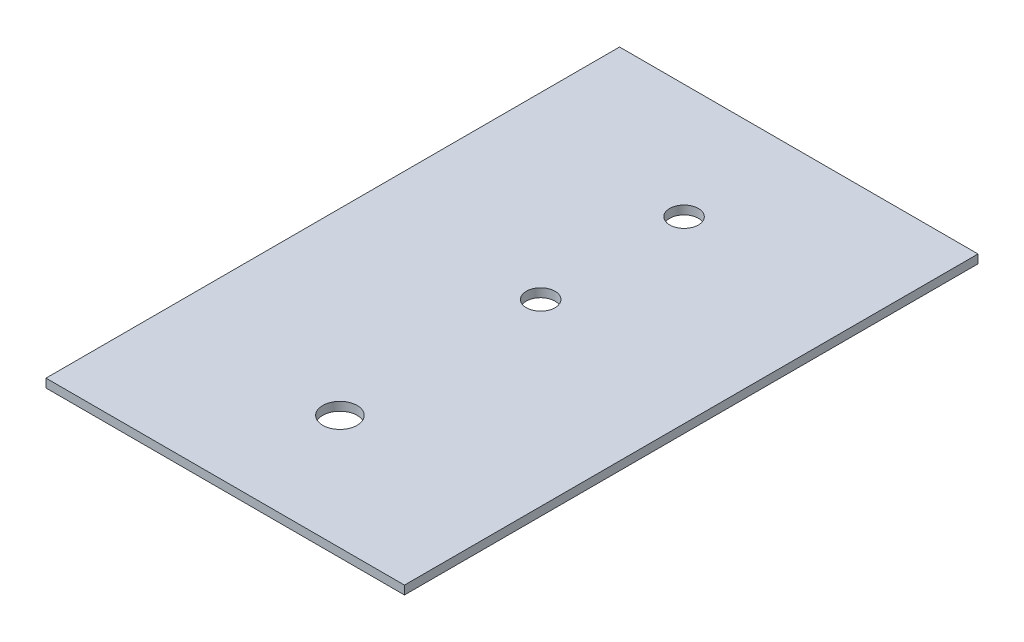
ISO-10303-21;
HEADER;
FILE_DESCRIPTION(('STEP AP214'),'2;1');
FILE_NAME('part.step','',(''),(''),'','','');
FILE_SCHEMA(('AUTOMOTIVE_DESIGN { 1 0 10303 214 1 1 1 1 }'));
ENDSEC;
DATA;
#1=APPLICATION_CONTEXT('core data for automotive mechanical design processes');
#2=APPLICATION_PROTOCOL_DEFINITION('international standard','automotive_design',2000,#1);
#3=PRODUCT_CONTEXT('',#1,'mechanical');
#4=PRODUCT('Part','Part','',(#3));
#5=PRODUCT_RELATED_PRODUCT_CATEGORY('part','',(#4));
#6=PRODUCT_DEFINITION_FORMATION('','',#4);
#7=PRODUCT_DEFINITION_CONTEXT('part definition',#1,'design');
#8=PRODUCT_DEFINITION('design','',#6,#7);
#9=PRODUCT_DEFINITION_SHAPE('','',#8);
#10=(LENGTH_UNIT() NAMED_UNIT(*) SI_UNIT(.MILLI.,.METRE.));
#11=(NAMED_UNIT(*) PLANE_ANGLE_UNIT() SI_UNIT($,.RADIAN.));
#12=(NAMED_UNIT(*) SI_UNIT($,.STERADIAN.) SOLID_ANGLE_UNIT());
#13=UNCERTAINTY_MEASURE_WITH_UNIT(LENGTH_MEASURE(1.E-05),#10,'distance_accuracy_value','');
#14=(GEOMETRIC_REPRESENTATION_CONTEXT(3) GLOBAL_UNCERTAINTY_ASSIGNED_CONTEXT((#13)) GLOBAL_UNIT_ASSIGNED_CONTEXT((#10,
#11,#12)) REPRESENTATION_CONTEXT('',''));
#15=CARTESIAN_POINT('',(0.,0.,0.));
#16=DIRECTION('',(0.,0.,1.));
#17=DIRECTION('',(1.,0.,0.));
#18=AXIS2_PLACEMENT_3D('',#15,#16,#17);
#19=CARTESIAN_POINT('',(62.5,3.,100.));
#20=DIRECTION('',(-1.,0.,0.));
#21=DIRECTION('',(0.,0.,1.));
#22=AXIS2_PLACEMENT_3D('',#19,#20,#21);
#23=PLANE('',#22);
#24=DIRECTION('',(0.,0.,-1.));
#25=VECTOR('',#24,1.);
#26=CARTESIAN_POINT('',(62.5,0.,100.));
#27=LINE('',#26,#25);
#28=CARTESIAN_POINT('',(62.5,0.,100.));
#29=VERTEX_POINT('',#28);
#30=CARTESIAN_POINT('',(62.5,0.,-100.));
#31=VERTEX_POINT('',#30);
#32=EDGE_CURVE('E106',#29,#31,#27,.T.);
#33=ORIENTED_EDGE('',*,*,#32,.T.);
#34=DIRECTION('',(0.,-1.,0.));
#35=VECTOR('',#34,1.);
#36=CARTESIAN_POINT('',(62.5,3.,-100.));
#37=LINE('',#36,#35);
#38=CARTESIAN_POINT('',(62.5,3.,-100.));
#39=VERTEX_POINT('',#38);
#40=EDGE_CURVE('E11',#39,#31,#37,.T.);
#41=ORIENTED_EDGE('',*,*,#40,.F.);
#42=DIRECTION('',(0.,0.,-1.));
#43=VECTOR('',#42,1.);
#44=CARTESIAN_POINT('',(62.5,3.,100.));
#45=LINE('',#44,#43);
#46=CARTESIAN_POINT('',(62.5,3.,100.));
#47=VERTEX_POINT('',#46);
#48=EDGE_CURVE('E90',#47,#39,#45,.T.);
#49=ORIENTED_EDGE('',*,*,#48,.F.);
#50=DIRECTION('',(0.,-1.,0.));
#51=VECTOR('',#50,1.);
#52=CARTESIAN_POINT('',(62.5,3.,100.));
#53=LINE('',#52,#51);
#54=EDGE_CURVE('E102',#47,#29,#53,.T.);
#55=ORIENTED_EDGE('',*,*,#54,.T.);
#56=EDGE_LOOP('',(#33,#41,#49,#55));
#57=FACE_BOUND('',#56,.T.);
#58=ADVANCED_FACE('F38',(#57),#23,.F.);
#59=CARTESIAN_POINT('',(-62.5,3.,-100.));
#60=DIRECTION('',(0.,0.,1.));
#61=DIRECTION('',(1.,0.,0.));
#62=AXIS2_PLACEMENT_3D('',#59,#60,#61);
#63=PLANE('',#62);
#64=DIRECTION('',(-1.,0.,0.));
#65=VECTOR('',#64,1.);
#66=CARTESIAN_POINT('',(-62.5,0.,-100.));
#67=LINE('',#66,#65);
#68=CARTESIAN_POINT('',(-62.5,0.,-100.));
#69=VERTEX_POINT('',#68);
#70=EDGE_CURVE('E95',#31,#69,#67,.T.);
#71=ORIENTED_EDGE('',*,*,#70,.T.);
#72=DIRECTION('',(0.,-1.,0.));
#73=VECTOR('',#72,1.);
#74=CARTESIAN_POINT('',(-62.5,3.,-100.));
#75=LINE('',#74,#73);
#76=CARTESIAN_POINT('',(-62.5,3.,-100.));
#77=VERTEX_POINT('',#76);
#78=EDGE_CURVE('E47',#77,#69,#75,.T.);
#79=ORIENTED_EDGE('',*,*,#78,.F.);
#80=DIRECTION('',(-1.,0.,0.));
#81=VECTOR('',#80,1.);
#82=CARTESIAN_POINT('',(-62.5,3.,-100.));
#83=LINE('',#82,#81);
#84=EDGE_CURVE('E85',#39,#77,#83,.T.);
#85=ORIENTED_EDGE('',*,*,#84,.F.);
#86=ORIENTED_EDGE('',*,*,#40,.T.);
#87=EDGE_LOOP('',(#71,#79,#85,#86));
#88=FACE_BOUND('',#87,.T.);
#89=ADVANCED_FACE('F94',(#88),#63,.F.);
#90=CARTESIAN_POINT('',(-62.5,3.,100.));
#91=DIRECTION('',(1.,0.,0.));
#92=DIRECTION('',(0.,0.,-1.));
#93=AXIS2_PLACEMENT_3D('',#90,#91,#92);
#94=PLANE('',#93);
#95=DIRECTION('',(0.,0.,1.));
#96=VECTOR('',#95,1.);
#97=CARTESIAN_POINT('',(-62.5,0.,100.));
#98=LINE('',#97,#96);
#99=CARTESIAN_POINT('',(-62.5,0.,100.));
#100=VERTEX_POINT('',#99);
#101=EDGE_CURVE('E72',#69,#100,#98,.T.);
#102=ORIENTED_EDGE('',*,*,#101,.T.);
#103=DIRECTION('',(0.,-1.,0.));
#104=VECTOR('',#103,1.);
#105=CARTESIAN_POINT('',(-62.5,3.,100.));
#106=LINE('',#105,#104);
#107=CARTESIAN_POINT('',(-62.5,3.,100.));
#108=VERTEX_POINT('',#107);
#109=EDGE_CURVE('E97',#108,#100,#106,.T.);
#110=ORIENTED_EDGE('',*,*,#109,.F.);
#111=DIRECTION('',(0.,0.,1.));
#112=VECTOR('',#111,1.);
#113=CARTESIAN_POINT('',(-62.5,3.,100.));
#114=LINE('',#113,#112);
#115=EDGE_CURVE('E88',#77,#108,#114,.T.);
#116=ORIENTED_EDGE('',*,*,#115,.F.);
#117=ORIENTED_EDGE('',*,*,#78,.T.);
#118=EDGE_LOOP('',(#102,#110,#116,#117));
#119=FACE_BOUND('',#118,.T.);
#120=ADVANCED_FACE('F98',(#119),#94,.F.);
#121=CARTESIAN_POINT('',(-62.5,3.,100.));
#122=DIRECTION('',(0.,0.,-1.));
#123=DIRECTION('',(-1.,0.,0.));
#124=AXIS2_PLACEMENT_3D('',#121,#122,#123);
#125=PLANE('',#124);
#126=DIRECTION('',(1.,0.,0.));
#127=VECTOR('',#126,1.);
#128=CARTESIAN_POINT('',(-62.5,0.,100.));
#129=LINE('',#128,#127);
#130=EDGE_CURVE('E78',#100,#29,#129,.T.);
#131=ORIENTED_EDGE('',*,*,#130,.T.);
#132=ORIENTED_EDGE('',*,*,#54,.F.);
#133=DIRECTION('',(1.,0.,0.));
#134=VECTOR('',#133,1.);
#135=CARTESIAN_POINT('',(-62.5,3.,100.));
#136=LINE('',#135,#134);
#137=EDGE_CURVE('E55',#108,#47,#136,.T.);
#138=ORIENTED_EDGE('',*,*,#137,.F.);
#139=ORIENTED_EDGE('',*,*,#109,.T.);
#140=EDGE_LOOP('',(#131,#132,#138,#139));
#141=FACE_BOUND('',#140,.T.);
#142=ADVANCED_FACE('F120',(#141),#125,.F.);
#143=CARTESIAN_POINT('',(0.,3.,0.));
#144=DIRECTION('',(0.,-1.,0.));
#145=DIRECTION('',(0.,0.,-1.));
#146=AXIS2_PLACEMENT_3D('',#143,#144,#145);
#147=PLANE('',#146);
#148=CARTESIAN_POINT('',(0.,3.,-60.));
#149=DIRECTION('',(0.,1.,0.));
#150=DIRECTION('',(0.,0.,1.));
#151=AXIS2_PLACEMENT_3D('',#148,#149,#150);
#152=CIRCLE('',#151,5.);
#153=CARTESIAN_POINT('',(0.,3.,-55.));
#154=VERTEX_POINT('',#153);
#155=EDGE_CURVE('E110',#154,#154,#152,.T.);
#156=ORIENTED_EDGE('',*,*,#155,.F.);
#157=EDGE_LOOP('',(#156));
#158=FACE_BOUND('',#157,.T.);
#159=CARTESIAN_POINT('',(0.,3.,60.));
#160=DIRECTION('',(0.,1.,0.));
#161=DIRECTION('',(0.,0.,1.));
#162=AXIS2_PLACEMENT_3D('',#159,#160,#161);
#163=CIRCLE('',#162,6.);
#164=CARTESIAN_POINT('',(0.,3.,66.));
#165=VERTEX_POINT('',#164);
#166=EDGE_CURVE('E139',#165,#165,#163,.T.);
#167=ORIENTED_EDGE('',*,*,#166,.F.);
#168=EDGE_LOOP('',(#167));
#169=FACE_BOUND('',#168,.T.);
#170=CARTESIAN_POINT('',(0.,3.,-10.));
#171=DIRECTION('',(0.,1.,0.));
#172=DIRECTION('',(0.,0.,1.));
#173=AXIS2_PLACEMENT_3D('',#170,#171,#172);
#174=CIRCLE('',#173,5.);
#175=CARTESIAN_POINT('',(0.,3.,-5.));
#176=VERTEX_POINT('',#175);
#177=EDGE_CURVE('E131',#176,#176,#174,.T.);
#178=ORIENTED_EDGE('',*,*,#177,.F.);
#179=EDGE_LOOP('',(#178));
#180=FACE_BOUND('',#179,.T.);
#181=ORIENTED_EDGE('',*,*,#48,.T.);
#182=ORIENTED_EDGE('',*,*,#84,.T.);
#183=ORIENTED_EDGE('',*,*,#115,.T.);
#184=ORIENTED_EDGE('',*,*,#137,.T.);
#185=EDGE_LOOP('',(#181,#182,#183,#184));
#186=FACE_BOUND('',#185,.T.);
#187=ADVANCED_FACE('F86',(#158,#169,#180,#186),#147,.F.);
#188=CARTESIAN_POINT('',(0.,0.,0.));
#189=DIRECTION('',(0.,-1.,0.));
#190=DIRECTION('',(0.,0.,-1.));
#191=AXIS2_PLACEMENT_3D('',#188,#189,#190);
#192=PLANE('',#191);
#193=CARTESIAN_POINT('',(0.,0.,-60.));
#194=DIRECTION('',(0.,-1.,0.));
#195=DIRECTION('',(0.,0.,-1.));
#196=AXIS2_PLACEMENT_3D('',#193,#194,#195);
#197=CIRCLE('',#196,5.);
#198=CARTESIAN_POINT('',(0.,0.,-55.));
#199=VERTEX_POINT('',#198);
#200=EDGE_CURVE('E143',#199,#199,#197,.F.);
#201=ORIENTED_EDGE('',*,*,#200,.T.);
#202=EDGE_LOOP('',(#201));
#203=FACE_BOUND('',#202,.T.);
#204=CARTESIAN_POINT('',(0.,0.,60.));
#205=DIRECTION('',(0.,-1.,0.));
#206=DIRECTION('',(0.,0.,-1.));
#207=AXIS2_PLACEMENT_3D('',#204,#205,#206);
#208=CIRCLE('',#207,6.);
#209=CARTESIAN_POINT('',(0.,0.,66.));
#210=VERTEX_POINT('',#209);
#211=EDGE_CURVE('E135',#210,#210,#208,.F.);
#212=ORIENTED_EDGE('',*,*,#211,.T.);
#213=EDGE_LOOP('',(#212));
#214=FACE_BOUND('',#213,.T.);
#215=CARTESIAN_POINT('',(0.,0.,-10.));
#216=DIRECTION('',(0.,-1.,0.));
#217=DIRECTION('',(0.,0.,-1.));
#218=AXIS2_PLACEMENT_3D('',#215,#216,#217);
#219=CIRCLE('',#218,5.);
#220=CARTESIAN_POINT('',(0.,0.,-5.));
#221=VERTEX_POINT('',#220);
#222=EDGE_CURVE('E127',#221,#221,#219,.F.);
#223=ORIENTED_EDGE('',*,*,#222,.T.);
#224=EDGE_LOOP('',(#223));
#225=FACE_BOUND('',#224,.T.);
#226=ORIENTED_EDGE('',*,*,#32,.F.);
#227=ORIENTED_EDGE('',*,*,#130,.F.);
#228=ORIENTED_EDGE('',*,*,#101,.F.);
#229=ORIENTED_EDGE('',*,*,#70,.F.);
#230=EDGE_LOOP('',(#226,#227,#228,#229));
#231=FACE_BOUND('',#230,.T.);
#232=ADVANCED_FACE('F123',(#203,#214,#225,#231),#192,.T.);
#233=CARTESIAN_POINT('',(0.,-0.00100000000000013,-10.));
#234=DIRECTION('',(0.,1.,0.));
#235=DIRECTION('',(0.,0.,1.));
#236=AXIS2_PLACEMENT_3D('',#233,#234,#235);
#237=CYLINDRICAL_SURFACE('',#236,5.);
#238=CARTESIAN_POINT('',(0.,0.,-5.));
#239=CARTESIAN_POINT('',(0.,0.03125,-5.));
#240=CARTESIAN_POINT('',(0.,0.0625,-5.));
#241=CARTESIAN_POINT('',(0.,0.125,-5.));
#242=CARTESIAN_POINT('',(0.,0.15625,-5.));
#243=CARTESIAN_POINT('',(0.,0.21875,-5.));
#244=CARTESIAN_POINT('',(0.,0.25,-5.));
#245=CARTESIAN_POINT('',(0.,0.3125,-5.));
#246=CARTESIAN_POINT('',(0.,0.34375,-5.));
#247=CARTESIAN_POINT('',(0.,0.40625,-5.));
#248=CARTESIAN_POINT('',(0.,0.4375,-5.));
#249=CARTESIAN_POINT('',(0.,0.5,-5.));
#250=CARTESIAN_POINT('',(0.,0.53125,-5.));
#251=CARTESIAN_POINT('',(0.,0.59375,-5.));
#252=CARTESIAN_POINT('',(0.,0.625,-5.));
#253=CARTESIAN_POINT('',(0.,0.6875,-5.));
#254=CARTESIAN_POINT('',(0.,0.71875,-5.));
#255=CARTESIAN_POINT('',(0.,0.78125,-5.));
#256=CARTESIAN_POINT('',(0.,0.8125,-5.));
#257=CARTESIAN_POINT('',(0.,0.875,-5.));
#258=CARTESIAN_POINT('',(0.,0.90625,-5.));
#259=CARTESIAN_POINT('',(0.,0.96875,-5.));
#260=CARTESIAN_POINT('',(0.,1.,-5.));
#261=CARTESIAN_POINT('',(0.,1.0625,-5.));
#262=CARTESIAN_POINT('',(0.,1.09375,-5.));
#263=CARTESIAN_POINT('',(0.,1.15625,-5.));
#264=CARTESIAN_POINT('',(0.,1.1875,-5.));
#265=CARTESIAN_POINT('',(0.,1.25,-5.));
#266=CARTESIAN_POINT('',(0.,1.28125,-5.));
#267=CARTESIAN_POINT('',(0.,1.34375,-5.));
#268=CARTESIAN_POINT('',(0.,1.375,-5.));
#269=CARTESIAN_POINT('',(0.,1.4375,-5.));
#270=CARTESIAN_POINT('',(0.,1.46875,-5.));
#271=CARTESIAN_POINT('',(0.,1.53125,-5.));
#272=CARTESIAN_POINT('',(0.,1.5625,-5.));
#273=CARTESIAN_POINT('',(0.,1.625,-5.));
#274=CARTESIAN_POINT('',(0.,1.65625,-5.));
#275=CARTESIAN_POINT('',(0.,1.71875,-5.));
#276=CARTESIAN_POINT('',(0.,1.75,-5.));
#277=CARTESIAN_POINT('',(0.,1.8125,-5.));
#278=CARTESIAN_POINT('',(0.,1.84375,-5.));
#279=CARTESIAN_POINT('',(0.,1.90625,-5.));
#280=CARTESIAN_POINT('',(0.,1.9375,-5.));
#281=CARTESIAN_POINT('',(0.,2.,-5.));
#282=CARTESIAN_POINT('',(0.,2.03125,-5.));
#283=CARTESIAN_POINT('',(0.,2.09375,-5.));
#284=CARTESIAN_POINT('',(0.,2.125,-5.));
#285=CARTESIAN_POINT('',(0.,2.1875,-5.));
#286=CARTESIAN_POINT('',(0.,2.21875,-5.));
#287=CARTESIAN_POINT('',(0.,2.28125,-5.));
#288=CARTESIAN_POINT('',(0.,2.3125,-5.));
#289=CARTESIAN_POINT('',(0.,2.375,-5.));
#290=CARTESIAN_POINT('',(0.,2.40625,-5.));
#291=CARTESIAN_POINT('',(0.,2.46875,-5.));
#292=CARTESIAN_POINT('',(0.,2.5,-5.));
#293=CARTESIAN_POINT('',(0.,2.5625,-5.));
#294=CARTESIAN_POINT('',(0.,2.59375,-5.));
#295=CARTESIAN_POINT('',(0.,2.65625,-5.));
#296=CARTESIAN_POINT('',(0.,2.6875,-5.));
#297=CARTESIAN_POINT('',(0.,2.75,-5.));
#298=CARTESIAN_POINT('',(0.,2.78125,-5.));
#299=CARTESIAN_POINT('',(0.,2.84375,-5.));
#300=CARTESIAN_POINT('',(0.,2.875,-5.));
#301=CARTESIAN_POINT('',(0.,2.9375,-5.));
#302=CARTESIAN_POINT('',(0.,2.96875,-5.));
#303=CARTESIAN_POINT('',(0.,3.,-5.));
#304=B_SPLINE_CURVE_WITH_KNOTS('',3,(#238,#239,#240,#241,#242,#243,#244,#245,#246,#247,#248,
#249,#250,#251,#252,#253,#254,#255,#256,#257,#258,#259,#260,#261,#262,#263,#264,#265,#266,#267,
#268,#269,#270,#271,#272,#273,#274,#275,#276,#277,#278,#279,#280,#281,#282,#283,#284,#285,#286,
#287,#288,#289,#290,#291,#292,#293,#294,#295,#296,#297,#298,#299,#300,#301,#302,#303),
.UNSPECIFIED.,.F.,.F.,(4,2,2,2,2,2,2,2,2,2,2,2,2,2,2,2,2,2,2,2,2,2,2,2,2,2,2,2,2,2,2,2,4),(0.,
0.09375,0.1875,0.28125,0.375,0.46875,0.5625,0.65625,0.75,0.84375,0.9375,1.03125,1.125,1.21875,
1.3125,1.40625,1.5,1.59375,1.6875,1.78125,1.875,1.96875,2.0625,2.15625,2.25,2.34375,2.4375,
2.53125,2.625,2.71875,2.8125,2.90625,3.),.UNSPECIFIED.);
#305=EDGE_CURVE('BSEAM160',#221,#176,#304,.T.);
#306=ORIENTED_EDGE('',*,*,#222,.F.);
#307=ORIENTED_EDGE('',*,*,#177,.T.);
#308=ORIENTED_EDGE('',*,*,#305,.T.);
#309=ORIENTED_EDGE('',*,*,#305,.F.);
#310=EDGE_LOOP('',(#306,#308,#307,#309));
#311=FACE_BOUND('',#310,.T.);
#312=ADVANCED_FACE('F160',(#311),#237,.F.);
#313=CARTESIAN_POINT('',(0.,-0.00100000000000013,60.));
#314=DIRECTION('',(0.,1.,0.));
#315=DIRECTION('',(0.,0.,1.));
#316=AXIS2_PLACEMENT_3D('',#313,#314,#315);
#317=CYLINDRICAL_SURFACE('',#316,6.);
#318=CARTESIAN_POINT('',(0.,0.,66.));
#319=CARTESIAN_POINT('',(0.,0.03125,66.));
#320=CARTESIAN_POINT('',(0.,0.0625,66.));
#321=CARTESIAN_POINT('',(0.,0.125,66.));
#322=CARTESIAN_POINT('',(0.,0.15625,66.));
#323=CARTESIAN_POINT('',(0.,0.21875,66.));
#324=CARTESIAN_POINT('',(0.,0.25,66.));
#325=CARTESIAN_POINT('',(0.,0.3125,66.));
#326=CARTESIAN_POINT('',(0.,0.34375,66.));
#327=CARTESIAN_POINT('',(0.,0.40625,66.));
#328=CARTESIAN_POINT('',(0.,0.4375,66.));
#329=CARTESIAN_POINT('',(0.,0.5,66.));
#330=CARTESIAN_POINT('',(0.,0.53125,66.));
#331=CARTESIAN_POINT('',(0.,0.59375,66.));
#332=CARTESIAN_POINT('',(0.,0.625,66.));
#333=CARTESIAN_POINT('',(0.,0.6875,66.));
#334=CARTESIAN_POINT('',(0.,0.71875,66.));
#335=CARTESIAN_POINT('',(0.,0.78125,66.));
#336=CARTESIAN_POINT('',(0.,0.8125,66.));
#337=CARTESIAN_POINT('',(0.,0.875,66.));
#338=CARTESIAN_POINT('',(0.,0.90625,66.));
#339=CARTESIAN_POINT('',(0.,0.96875,66.));
#340=CARTESIAN_POINT('',(0.,1.,66.));
#341=CARTESIAN_POINT('',(0.,1.0625,66.));
#342=CARTESIAN_POINT('',(0.,1.09375,66.));
#343=CARTESIAN_POINT('',(0.,1.15625,66.));
#344=CARTESIAN_POINT('',(0.,1.1875,66.));
#345=CARTESIAN_POINT('',(0.,1.25,66.));
#346=CARTESIAN_POINT('',(0.,1.28125,66.));
#347=CARTESIAN_POINT('',(0.,1.34375,66.));
#348=CARTESIAN_POINT('',(0.,1.375,66.));
#349=CARTESIAN_POINT('',(0.,1.4375,66.));
#350=CARTESIAN_POINT('',(0.,1.46875,66.));
#351=CARTESIAN_POINT('',(0.,1.53125,66.));
#352=CARTESIAN_POINT('',(0.,1.5625,66.));
#353=CARTESIAN_POINT('',(0.,1.625,66.));
#354=CARTESIAN_POINT('',(0.,1.65625,66.));
#355=CARTESIAN_POINT('',(0.,1.71875,66.));
#356=CARTESIAN_POINT('',(0.,1.75,66.));
#357=CARTESIAN_POINT('',(0.,1.8125,66.));
#358=CARTESIAN_POINT('',(0.,1.84375,66.));
#359=CARTESIAN_POINT('',(0.,1.90625,66.));
#360=CARTESIAN_POINT('',(0.,1.9375,66.));
#361=CARTESIAN_POINT('',(0.,2.,66.));
#362=CARTESIAN_POINT('',(0.,2.03125,66.));
#363=CARTESIAN_POINT('',(0.,2.09375,66.));
#364=CARTESIAN_POINT('',(0.,2.125,66.));
#365=CARTESIAN_POINT('',(0.,2.1875,66.));
#366=CARTESIAN_POINT('',(0.,2.21875,66.));
#367=CARTESIAN_POINT('',(0.,2.28125,66.));
#368=CARTESIAN_POINT('',(0.,2.3125,66.));
#369=CARTESIAN_POINT('',(0.,2.375,66.));
#370=CARTESIAN_POINT('',(0.,2.40625,66.));
#371=CARTESIAN_POINT('',(0.,2.46875,66.));
#372=CARTESIAN_POINT('',(0.,2.5,66.));
#373=CARTESIAN_POINT('',(0.,2.5625,66.));
#374=CARTESIAN_POINT('',(0.,2.59375,66.));
#375=CARTESIAN_POINT('',(0.,2.65625,66.));
#376=CARTESIAN_POINT('',(0.,2.6875,66.));
#377=CARTESIAN_POINT('',(0.,2.75,66.));
#378=CARTESIAN_POINT('',(0.,2.78125,66.));
#379=CARTESIAN_POINT('',(0.,2.84375,66.));
#380=CARTESIAN_POINT('',(0.,2.875,66.));
#381=CARTESIAN_POINT('',(0.,2.9375,66.));
#382=CARTESIAN_POINT('',(0.,2.96875,66.));
#383=CARTESIAN_POINT('',(0.,3.,66.));
#384=B_SPLINE_CURVE_WITH_KNOTS('',3,(#318,#319,#320,#321,#322,#323,#324,#325,#326,#327,#328,
#329,#330,#331,#332,#333,#334,#335,#336,#337,#338,#339,#340,#341,#342,#343,#344,#345,#346,#347,
#348,#349,#350,#351,#352,#353,#354,#355,#356,#357,#358,#359,#360,#361,#362,#363,#364,#365,#366,
#367,#368,#369,#370,#371,#372,#373,#374,#375,#376,#377,#378,#379,#380,#381,#382,#383),
.UNSPECIFIED.,.F.,.F.,(4,2,2,2,2,2,2,2,2,2,2,2,2,2,2,2,2,2,2,2,2,2,2,2,2,2,2,2,2,2,2,2,4),(0.,
0.09375,0.1875,0.28125,0.375,0.46875,0.5625,0.65625,0.75,0.84375,0.9375,1.03125,1.125,1.21875,
1.3125,1.40625,1.5,1.59375,1.6875,1.78125,1.875,1.96875,2.0625,2.15625,2.25,2.34375,2.4375,
2.53125,2.625,2.71875,2.8125,2.90625,3.),.UNSPECIFIED.);
#385=EDGE_CURVE('BSEAM162',#210,#165,#384,.T.);
#386=ORIENTED_EDGE('',*,*,#211,.F.);
#387=ORIENTED_EDGE('',*,*,#166,.T.);
#388=ORIENTED_EDGE('',*,*,#385,.T.);
#389=ORIENTED_EDGE('',*,*,#385,.F.);
#390=EDGE_LOOP('',(#386,#388,#387,#389));
#391=FACE_BOUND('',#390,.T.);
#392=ADVANCED_FACE('F162',(#391),#317,.F.);
#393=CARTESIAN_POINT('',(0.,-0.00100000000000013,-60.));
#394=DIRECTION('',(0.,1.,0.));
#395=DIRECTION('',(0.,0.,1.));
#396=AXIS2_PLACEMENT_3D('',#393,#394,#395);
#397=CYLINDRICAL_SURFACE('',#396,5.);
#398=CARTESIAN_POINT('',(0.,0.,-55.));
#399=CARTESIAN_POINT('',(0.,0.03125,-55.));
#400=CARTESIAN_POINT('',(0.,0.0625,-55.));
#401=CARTESIAN_POINT('',(0.,0.125,-55.));
#402=CARTESIAN_POINT('',(0.,0.15625,-55.));
#403=CARTESIAN_POINT('',(0.,0.21875,-55.));
#404=CARTESIAN_POINT('',(0.,0.25,-55.));
#405=CARTESIAN_POINT('',(0.,0.3125,-55.));
#406=CARTESIAN_POINT('',(0.,0.34375,-55.));
#407=CARTESIAN_POINT('',(0.,0.40625,-55.));
#408=CARTESIAN_POINT('',(0.,0.4375,-55.));
#409=CARTESIAN_POINT('',(0.,0.5,-55.));
#410=CARTESIAN_POINT('',(0.,0.53125,-55.));
#411=CARTESIAN_POINT('',(0.,0.59375,-55.));
#412=CARTESIAN_POINT('',(0.,0.625,-55.));
#413=CARTESIAN_POINT('',(0.,0.6875,-55.));
#414=CARTESIAN_POINT('',(0.,0.71875,-55.));
#415=CARTESIAN_POINT('',(0.,0.78125,-55.));
#416=CARTESIAN_POINT('',(0.,0.8125,-55.));
#417=CARTESIAN_POINT('',(0.,0.875,-55.));
#418=CARTESIAN_POINT('',(0.,0.90625,-55.));
#419=CARTESIAN_POINT('',(0.,0.96875,-55.));
#420=CARTESIAN_POINT('',(0.,1.,-55.));
#421=CARTESIAN_POINT('',(0.,1.0625,-55.));
#422=CARTESIAN_POINT('',(0.,1.09375,-55.));
#423=CARTESIAN_POINT('',(0.,1.15625,-55.));
#424=CARTESIAN_POINT('',(0.,1.1875,-55.));
#425=CARTESIAN_POINT('',(0.,1.25,-55.));
#426=CARTESIAN_POINT('',(0.,1.28125,-55.));
#427=CARTESIAN_POINT('',(0.,1.34375,-55.));
#428=CARTESIAN_POINT('',(0.,1.375,-55.));
#429=CARTESIAN_POINT('',(0.,1.4375,-55.));
#430=CARTESIAN_POINT('',(0.,1.46875,-55.));
#431=CARTESIAN_POINT('',(0.,1.53125,-55.));
#432=CARTESIAN_POINT('',(0.,1.5625,-55.));
#433=CARTESIAN_POINT('',(0.,1.625,-55.));
#434=CARTESIAN_POINT('',(0.,1.65625,-55.));
#435=CARTESIAN_POINT('',(0.,1.71875,-55.));
#436=CARTESIAN_POINT('',(0.,1.75,-55.));
#437=CARTESIAN_POINT('',(0.,1.8125,-55.));
#438=CARTESIAN_POINT('',(0.,1.84375,-55.));
#439=CARTESIAN_POINT('',(0.,1.90625,-55.));
#440=CARTESIAN_POINT('',(0.,1.9375,-55.));
#441=CARTESIAN_POINT('',(0.,2.,-55.));
#442=CARTESIAN_POINT('',(0.,2.03125,-55.));
#443=CARTESIAN_POINT('',(0.,2.09375,-55.));
#444=CARTESIAN_POINT('',(0.,2.125,-55.));
#445=CARTESIAN_POINT('',(0.,2.1875,-55.));
#446=CARTESIAN_POINT('',(0.,2.21875,-55.));
#447=CARTESIAN_POINT('',(0.,2.28125,-55.));
#448=CARTESIAN_POINT('',(0.,2.3125,-55.));
#449=CARTESIAN_POINT('',(0.,2.375,-55.));
#450=CARTESIAN_POINT('',(0.,2.40625,-55.));
#451=CARTESIAN_POINT('',(0.,2.46875,-55.));
#452=CARTESIAN_POINT('',(0.,2.5,-55.));
#453=CARTESIAN_POINT('',(0.,2.5625,-55.));
#454=CARTESIAN_POINT('',(0.,2.59375,-55.));
#455=CARTESIAN_POINT('',(0.,2.65625,-55.));
#456=CARTESIAN_POINT('',(0.,2.6875,-55.));
#457=CARTESIAN_POINT('',(0.,2.75,-55.));
#458=CARTESIAN_POINT('',(0.,2.78125,-55.));
#459=CARTESIAN_POINT('',(0.,2.84375,-55.));
#460=CARTESIAN_POINT('',(0.,2.875,-55.));
#461=CARTESIAN_POINT('',(0.,2.9375,-55.));
#462=CARTESIAN_POINT('',(0.,2.96875,-55.));
#463=CARTESIAN_POINT('',(0.,3.,-55.));
#464=B_SPLINE_CURVE_WITH_KNOTS('',3,(#398,#399,#400,#401,#402,#403,#404,#405,#406,#407,#408,
#409,#410,#411,#412,#413,#414,#415,#416,#417,#418,#419,#420,#421,#422,#423,#424,#425,#426,#427,
#428,#429,#430,#431,#432,#433,#434,#435,#436,#437,#438,#439,#440,#441,#442,#443,#444,#445,#446,
#447,#448,#449,#450,#451,#452,#453,#454,#455,#456,#457,#458,#459,#460,#461,#462,#463),
.UNSPECIFIED.,.F.,.F.,(4,2,2,2,2,2,2,2,2,2,2,2,2,2,2,2,2,2,2,2,2,2,2,2,2,2,2,2,2,2,2,2,4),(0.,
0.09375,0.1875,0.28125,0.375,0.46875,0.5625,0.65625,0.75,0.84375,0.9375,1.03125,1.125,1.21875,
1.3125,1.40625,1.5,1.59375,1.6875,1.78125,1.875,1.96875,2.0625,2.15625,2.25,2.34375,2.4375,
2.53125,2.625,2.71875,2.8125,2.90625,3.),.UNSPECIFIED.);
#465=EDGE_CURVE('BSEAM151',#199,#154,#464,.T.);
#466=ORIENTED_EDGE('',*,*,#200,.F.);
#467=ORIENTED_EDGE('',*,*,#155,.T.);
#468=ORIENTED_EDGE('',*,*,#465,.T.);
#469=ORIENTED_EDGE('',*,*,#465,.F.);
#470=EDGE_LOOP('',(#466,#468,#467,#469));
#471=FACE_BOUND('',#470,.T.);
#472=ADVANCED_FACE('F151',(#471),#397,.F.);
#473=CLOSED_SHELL('',(#58,#89,#120,#142,#187,#232,#312,#392,#472));
#474=MANIFOLD_SOLID_BREP('B2',#473);
#475=ADVANCED_BREP_SHAPE_REPRESENTATION('',(#18,#474),#14);
#476=SHAPE_DEFINITION_REPRESENTATION(#9,#475);
ENDSEC;
END-ISO-10303-21;
